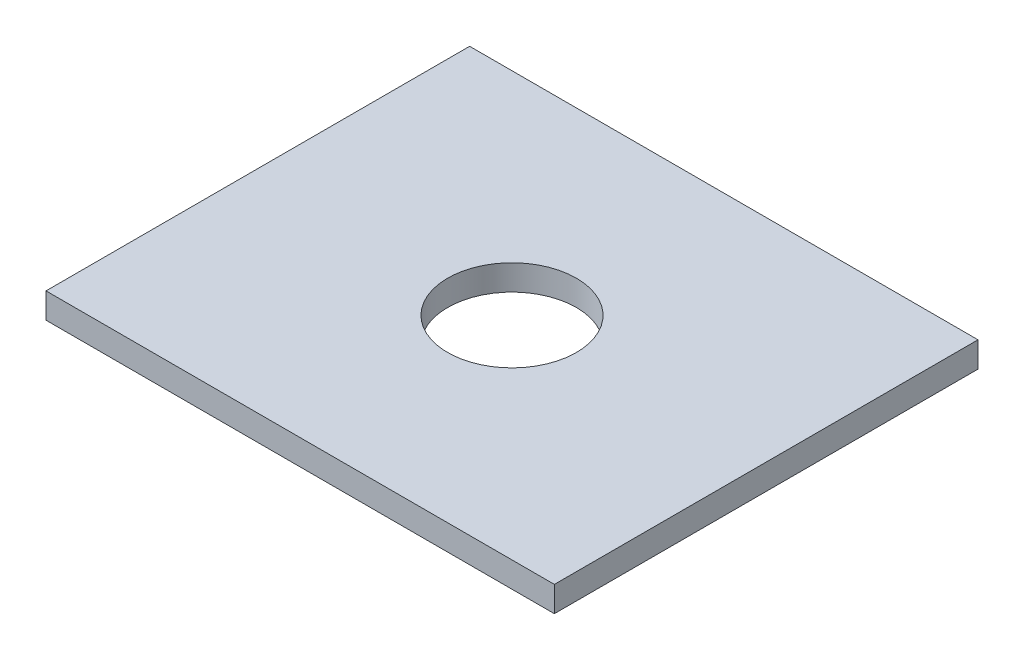
ISO-10303-21;
HEADER;
FILE_DESCRIPTION(('STEP AP214'),'2;1');
FILE_NAME('part.step','',(''),(''),'','','');
FILE_SCHEMA(('AUTOMOTIVE_DESIGN { 1 0 10303 214 1 1 1 1 }'));
ENDSEC;
DATA;
#1=APPLICATION_CONTEXT('core data for automotive mechanical design processes');
#2=APPLICATION_PROTOCOL_DEFINITION('international standard','automotive_design',2000,#1);
#3=PRODUCT_CONTEXT('',#1,'mechanical');
#4=PRODUCT('Part','Part','',(#3));
#5=PRODUCT_RELATED_PRODUCT_CATEGORY('part','',(#4));
#6=PRODUCT_DEFINITION_FORMATION('','',#4);
#7=PRODUCT_DEFINITION_CONTEXT('part definition',#1,'design');
#8=PRODUCT_DEFINITION('design','',#6,#7);
#9=PRODUCT_DEFINITION_SHAPE('','',#8);
#10=(LENGTH_UNIT() NAMED_UNIT(*) SI_UNIT(.MILLI.,.METRE.));
#11=(NAMED_UNIT(*) PLANE_ANGLE_UNIT() SI_UNIT($,.RADIAN.));
#12=(NAMED_UNIT(*) SI_UNIT($,.STERADIAN.) SOLID_ANGLE_UNIT());
#13=UNCERTAINTY_MEASURE_WITH_UNIT(LENGTH_MEASURE(1.E-05),#10,'distance_accuracy_value','');
#14=(GEOMETRIC_REPRESENTATION_CONTEXT(3) GLOBAL_UNCERTAINTY_ASSIGNED_CONTEXT((#13)) GLOBAL_UNIT_ASSIGNED_CONTEXT((#10,
#11,#12)) REPRESENTATION_CONTEXT('',''));
#15=CARTESIAN_POINT('',(0.,0.,0.));
#16=DIRECTION('',(0.,0.,1.));
#17=DIRECTION('',(1.,0.,0.));
#18=AXIS2_PLACEMENT_3D('',#15,#16,#17);
#19=CARTESIAN_POINT('',(-150.,-15.,125.));
#20=DIRECTION('',(-1.,0.,0.));
#21=DIRECTION('',(0.,0.,1.));
#22=AXIS2_PLACEMENT_3D('',#19,#20,#21);
#23=PLANE('',#22);
#24=DIRECTION('',(0.,0.,1.));
#25=VECTOR('',#24,1.);
#26=CARTESIAN_POINT('',(-150.,0.,125.));
#27=LINE('',#26,#25);
#28=CARTESIAN_POINT('',(-150.,0.,-125.));
#29=VERTEX_POINT('',#28);
#30=CARTESIAN_POINT('',(-150.,0.,125.));
#31=VERTEX_POINT('',#30);
#32=EDGE_CURVE('E125',#29,#31,#27,.T.);
#33=ORIENTED_EDGE('',*,*,#32,.F.);
#34=DIRECTION('',(0.,1.,0.));
#35=VECTOR('',#34,1.);
#36=CARTESIAN_POINT('',(-150.,-15.,-125.));
#37=LINE('',#36,#35);
#38=CARTESIAN_POINT('',(-150.,-15.,-125.));
#39=VERTEX_POINT('',#38);
#40=EDGE_CURVE('E12',#39,#29,#37,.T.);
#41=ORIENTED_EDGE('',*,*,#40,.F.);
#42=DIRECTION('',(0.,0.,1.));
#43=VECTOR('',#42,1.);
#44=CARTESIAN_POINT('',(-150.,-15.,125.));
#45=LINE('',#44,#43);
#46=CARTESIAN_POINT('',(-150.,-15.,125.));
#47=VERTEX_POINT('',#46);
#48=EDGE_CURVE('E116',#39,#47,#45,.T.);
#49=ORIENTED_EDGE('',*,*,#48,.T.);
#50=DIRECTION('',(0.,1.,0.));
#51=VECTOR('',#50,1.);
#52=CARTESIAN_POINT('',(-150.,-15.,125.));
#53=LINE('',#52,#51);
#54=EDGE_CURVE('E53',#47,#31,#53,.T.);
#55=ORIENTED_EDGE('',*,*,#54,.T.);
#56=EDGE_LOOP('',(#33,#41,#49,#55));
#57=FACE_BOUND('',#56,.T.);
#58=ADVANCED_FACE('F50',(#57),#23,.T.);
#59=CARTESIAN_POINT('',(150.,-15.,-125.));
#60=DIRECTION('',(0.,0.,-1.));
#61=DIRECTION('',(-1.,0.,0.));
#62=AXIS2_PLACEMENT_3D('',#59,#60,#61);
#63=PLANE('',#62);
#64=DIRECTION('',(-1.,0.,0.));
#65=VECTOR('',#64,1.);
#66=CARTESIAN_POINT('',(150.,0.,-125.));
#67=LINE('',#66,#65);
#68=CARTESIAN_POINT('',(150.,0.,-125.));
#69=VERTEX_POINT('',#68);
#70=EDGE_CURVE('E119',#69,#29,#67,.T.);
#71=ORIENTED_EDGE('',*,*,#70,.F.);
#72=DIRECTION('',(0.,1.,0.));
#73=VECTOR('',#72,1.);
#74=CARTESIAN_POINT('',(150.,-15.,-125.));
#75=LINE('',#74,#73);
#76=CARTESIAN_POINT('',(150.,-15.,-125.));
#77=VERTEX_POINT('',#76);
#78=EDGE_CURVE('E60',#77,#69,#75,.T.);
#79=ORIENTED_EDGE('',*,*,#78,.F.);
#80=DIRECTION('',(-1.,0.,0.));
#81=VECTOR('',#80,1.);
#82=CARTESIAN_POINT('',(150.,-15.,-125.));
#83=LINE('',#82,#81);
#84=EDGE_CURVE('E111',#77,#39,#83,.T.);
#85=ORIENTED_EDGE('',*,*,#84,.T.);
#86=ORIENTED_EDGE('',*,*,#40,.T.);
#87=EDGE_LOOP('',(#71,#79,#85,#86));
#88=FACE_BOUND('',#87,.T.);
#89=ADVANCED_FACE('F169',(#88),#63,.T.);
#90=CARTESIAN_POINT('',(150.,-15.,125.));
#91=DIRECTION('',(1.,0.,0.));
#92=DIRECTION('',(0.,0.,-1.));
#93=AXIS2_PLACEMENT_3D('',#90,#91,#92);
#94=PLANE('',#93);
#95=DIRECTION('',(0.,0.,-1.));
#96=VECTOR('',#95,1.);
#97=CARTESIAN_POINT('',(150.,0.,125.));
#98=LINE('',#97,#96);
#99=CARTESIAN_POINT('',(150.,0.,125.));
#100=VERTEX_POINT('',#99);
#101=EDGE_CURVE('E105',#100,#69,#98,.T.);
#102=ORIENTED_EDGE('',*,*,#101,.F.);
#103=DIRECTION('',(0.,1.,0.));
#104=VECTOR('',#103,1.);
#105=CARTESIAN_POINT('',(150.,-15.,125.));
#106=LINE('',#105,#104);
#107=CARTESIAN_POINT('',(150.,-15.,125.));
#108=VERTEX_POINT('',#107);
#109=EDGE_CURVE('E100',#108,#100,#106,.T.);
#110=ORIENTED_EDGE('',*,*,#109,.F.);
#111=DIRECTION('',(0.,0.,-1.));
#112=VECTOR('',#111,1.);
#113=CARTESIAN_POINT('',(150.,-15.,125.));
#114=LINE('',#113,#112);
#115=EDGE_CURVE('E103',#108,#77,#114,.T.);
#116=ORIENTED_EDGE('',*,*,#115,.T.);
#117=ORIENTED_EDGE('',*,*,#78,.T.);
#118=EDGE_LOOP('',(#102,#110,#116,#117));
#119=FACE_BOUND('',#118,.T.);
#120=ADVANCED_FACE('F102',(#119),#94,.T.);
#121=CARTESIAN_POINT('',(150.,-15.,125.));
#122=DIRECTION('',(0.,0.,1.));
#123=DIRECTION('',(1.,0.,0.));
#124=AXIS2_PLACEMENT_3D('',#121,#122,#123);
#125=PLANE('',#124);
#126=DIRECTION('',(1.,0.,0.));
#127=VECTOR('',#126,1.);
#128=CARTESIAN_POINT('',(150.,0.,125.));
#129=LINE('',#128,#127);
#130=EDGE_CURVE('E129',#31,#100,#129,.T.);
#131=ORIENTED_EDGE('',*,*,#130,.F.);
#132=ORIENTED_EDGE('',*,*,#54,.F.);
#133=DIRECTION('',(1.,0.,0.));
#134=VECTOR('',#133,1.);
#135=CARTESIAN_POINT('',(150.,-15.,125.));
#136=LINE('',#135,#134);
#137=EDGE_CURVE('E110',#47,#108,#136,.T.);
#138=ORIENTED_EDGE('',*,*,#137,.T.);
#139=ORIENTED_EDGE('',*,*,#109,.T.);
#140=EDGE_LOOP('',(#131,#132,#138,#139));
#141=FACE_BOUND('',#140,.T.);
#142=ADVANCED_FACE('F114',(#141),#125,.T.);
#143=CARTESIAN_POINT('',(0.,-15.,0.));
#144=DIRECTION('',(0.,1.,0.));
#145=DIRECTION('',(0.,0.,1.));
#146=AXIS2_PLACEMENT_3D('',#143,#144,#145);
#147=PLANE('',#146);
#148=CARTESIAN_POINT('',(0.,-15.,0.));
#149=DIRECTION('',(0.,-1.,0.));
#150=DIRECTION('',(0.,0.,-1.));
#151=AXIS2_PLACEMENT_3D('',#148,#149,#150);
#152=CIRCLE('',#151,38.);
#153=CARTESIAN_POINT('',(0.,-15.,-38.));
#154=VERTEX_POINT('',#153);
#155=EDGE_CURVE('E147',#154,#154,#152,.T.);
#156=ORIENTED_EDGE('',*,*,#155,.F.);
#157=EDGE_LOOP('',(#156));
#158=FACE_BOUND('',#157,.T.);
#159=ORIENTED_EDGE('',*,*,#48,.F.);
#160=ORIENTED_EDGE('',*,*,#84,.F.);
#161=ORIENTED_EDGE('',*,*,#115,.F.);
#162=ORIENTED_EDGE('',*,*,#137,.F.);
#163=EDGE_LOOP('',(#159,#160,#161,#162));
#164=FACE_BOUND('',#163,.T.);
#165=ADVANCED_FACE('F109',(#158,#164),#147,.F.);
#166=CARTESIAN_POINT('',(0.,0.,0.));
#167=DIRECTION('',(0.,1.,0.));
#168=DIRECTION('',(0.,0.,1.));
#169=AXIS2_PLACEMENT_3D('',#166,#167,#168);
#170=PLANE('',#169);
#171=CARTESIAN_POINT('',(0.,0.,0.));
#172=DIRECTION('',(0.,-1.,0.));
#173=DIRECTION('',(0.,0.,-1.));
#174=AXIS2_PLACEMENT_3D('',#171,#172,#173);
#175=CIRCLE('',#174,38.);
#176=CARTESIAN_POINT('',(0.,0.,-38.));
#177=VERTEX_POINT('',#176);
#178=EDGE_CURVE('E130',#177,#177,#175,.T.);
#179=ORIENTED_EDGE('',*,*,#178,.T.);
#180=EDGE_LOOP('',(#179));
#181=FACE_BOUND('',#180,.T.);
#182=ORIENTED_EDGE('',*,*,#32,.T.);
#183=ORIENTED_EDGE('',*,*,#130,.T.);
#184=ORIENTED_EDGE('',*,*,#101,.T.);
#185=ORIENTED_EDGE('',*,*,#70,.T.);
#186=EDGE_LOOP('',(#182,#183,#184,#185));
#187=FACE_BOUND('',#186,.T.);
#188=ADVANCED_FACE('F159',(#181,#187),#170,.T.);
#189=CARTESIAN_POINT('',(0.,0.,0.));
#190=DIRECTION('',(0.,-1.,0.));
#191=DIRECTION('',(0.,0.,-1.));
#192=AXIS2_PLACEMENT_3D('',#189,#190,#191);
#193=CYLINDRICAL_SURFACE('',#192,38.);
#194=ORIENTED_EDGE('',*,*,#178,.F.);
#195=EDGE_LOOP('',(#194));
#196=FACE_BOUND('',#195,.T.);
#197=ORIENTED_EDGE('',*,*,#155,.T.);
#198=EDGE_LOOP('',(#197));
#199=FACE_BOUND('',#198,.T.);
#200=ADVANCED_FACE('F156',(#196,#199),#193,.F.);
#201=CLOSED_SHELL('',(#58,#89,#120,#142,#165,#188,#200));
#202=MANIFOLD_SOLID_BREP('B2',#201);
#203=ADVANCED_BREP_SHAPE_REPRESENTATION('',(#18,#202),#14);
#204=SHAPE_DEFINITION_REPRESENTATION(#9,#203);
ENDSEC;
END-ISO-10303-21;
